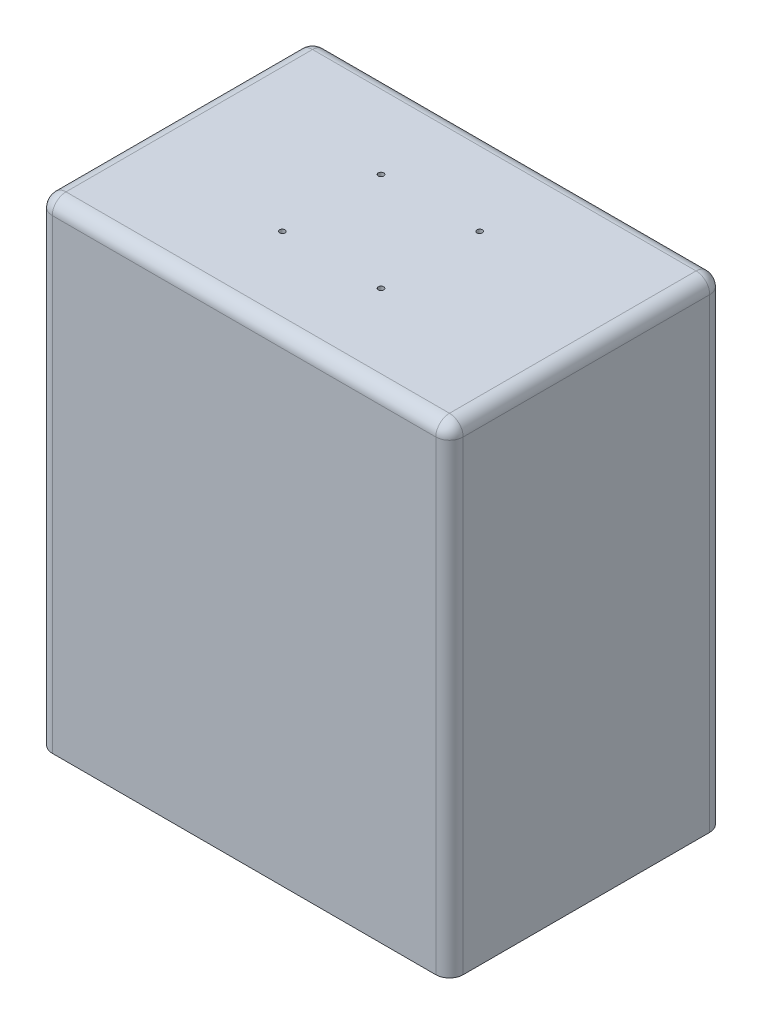
ISO-10303-21;
HEADER;
FILE_DESCRIPTION(('STEP AP214'),'2;1');
FILE_NAME('part.step','',(''),(''),'','','');
FILE_SCHEMA(('AUTOMOTIVE_DESIGN { 1 0 10303 214 1 1 1 1 }'));
ENDSEC;
DATA;
#1=APPLICATION_CONTEXT('core data for automotive mechanical design processes');
#2=APPLICATION_PROTOCOL_DEFINITION('international standard','automotive_design',2000,#1);
#3=PRODUCT_CONTEXT('',#1,'mechanical');
#4=PRODUCT('Part','Part','',(#3));
#5=PRODUCT_RELATED_PRODUCT_CATEGORY('part','',(#4));
#6=PRODUCT_DEFINITION_FORMATION('','',#4);
#7=PRODUCT_DEFINITION_CONTEXT('part definition',#1,'design');
#8=PRODUCT_DEFINITION('design','',#6,#7);
#9=PRODUCT_DEFINITION_SHAPE('','',#8);
#10=(LENGTH_UNIT() NAMED_UNIT(*) SI_UNIT(.MILLI.,.METRE.));
#11=(NAMED_UNIT(*) PLANE_ANGLE_UNIT() SI_UNIT($,.RADIAN.));
#12=(NAMED_UNIT(*) SI_UNIT($,.STERADIAN.) SOLID_ANGLE_UNIT());
#13=UNCERTAINTY_MEASURE_WITH_UNIT(LENGTH_MEASURE(1.E-05),#10,'distance_accuracy_value','');
#14=(GEOMETRIC_REPRESENTATION_CONTEXT(3) GLOBAL_UNCERTAINTY_ASSIGNED_CONTEXT((#13)) GLOBAL_UNIT_ASSIGNED_CONTEXT((#10,
#11,#12)) REPRESENTATION_CONTEXT('',''));
#15=CARTESIAN_POINT('',(0.,0.,0.));
#16=DIRECTION('',(0.,0.,1.));
#17=DIRECTION('',(1.,0.,0.));
#18=AXIS2_PLACEMENT_3D('',#15,#16,#17);
#19=CARTESIAN_POINT('',(-150.,350.,-100.));
#20=DIRECTION('',(1.,0.,0.));
#21=DIRECTION('',(0.,0.,-1.));
#22=AXIS2_PLACEMENT_3D('',#19,#20,#21);
#23=PLANE('',#22);
#24=DIRECTION('',(0.,0.,1.));
#25=VECTOR('',#24,1.);
#26=CARTESIAN_POINT('',(-150.,0.,-100.));
#27=LINE('',#26,#25);
#28=CARTESIAN_POINT('',(-150.,0.,-90.));
#29=VERTEX_POINT('',#28);
#30=CARTESIAN_POINT('',(-150.,0.,90.));
#31=VERTEX_POINT('',#30);
#32=EDGE_CURVE('E167',#29,#31,#27,.T.);
#33=ORIENTED_EDGE('',*,*,#32,.T.);
#34=DIRECTION('',(0.,-1.,0.));
#35=VECTOR('',#34,1.);
#36=CARTESIAN_POINT('',(-150.,350.,90.));
#37=LINE('',#36,#35);
#38=CARTESIAN_POINT('',(-150.,340.,90.));
#39=VERTEX_POINT('',#38);
#40=EDGE_CURVE('E272',#31,#39,#37,.F.);
#41=ORIENTED_EDGE('',*,*,#40,.T.);
#42=DIRECTION('',(0.,0.,1.));
#43=VECTOR('',#42,1.);
#44=CARTESIAN_POINT('',(-150.,340.,-100.));
#45=LINE('',#44,#43);
#46=CARTESIAN_POINT('',(-150.,340.,-90.));
#47=VERTEX_POINT('',#46);
#48=EDGE_CURVE('E266',#39,#47,#45,.F.);
#49=ORIENTED_EDGE('',*,*,#48,.T.);
#50=DIRECTION('',(0.,-1.,0.));
#51=VECTOR('',#50,1.);
#52=CARTESIAN_POINT('',(-150.,350.,-90.));
#53=LINE('',#52,#51);
#54=EDGE_CURVE('E269',#47,#29,#53,.T.);
#55=ORIENTED_EDGE('',*,*,#54,.T.);
#56=EDGE_LOOP('',(#33,#41,#49,#55));
#57=FACE_BOUND('',#56,.T.);
#58=ADVANCED_FACE('F39',(#57),#23,.F.);
#59=CARTESIAN_POINT('',(-150.,350.,100.));
#60=DIRECTION('',(0.,0.,-1.));
#61=DIRECTION('',(-1.,0.,0.));
#62=AXIS2_PLACEMENT_3D('',#59,#60,#61);
#63=PLANE('',#62);
#64=DIRECTION('',(1.,0.,0.));
#65=VECTOR('',#64,1.);
#66=CARTESIAN_POINT('',(-150.,340.,100.));
#67=LINE('',#66,#65);
#68=CARTESIAN_POINT('',(140.,340.,100.));
#69=VERTEX_POINT('',#68);
#70=CARTESIAN_POINT('',(-140.,340.,100.));
#71=VERTEX_POINT('',#70);
#72=EDGE_CURVE('E247',#69,#71,#67,.F.);
#73=ORIENTED_EDGE('',*,*,#72,.T.);
#74=DIRECTION('',(0.,-1.,0.));
#75=VECTOR('',#74,1.);
#76=CARTESIAN_POINT('',(-140.,350.,100.));
#77=LINE('',#76,#75);
#78=CARTESIAN_POINT('',(-140.,0.,100.));
#79=VERTEX_POINT('',#78);
#80=EDGE_CURVE('E251',#71,#79,#77,.T.);
#81=ORIENTED_EDGE('',*,*,#80,.T.);
#82=DIRECTION('',(1.,0.,0.));
#83=VECTOR('',#82,1.);
#84=CARTESIAN_POINT('',(-150.,0.,100.));
#85=LINE('',#84,#83);
#86=CARTESIAN_POINT('',(140.,0.,100.));
#87=VERTEX_POINT('',#86);
#88=EDGE_CURVE('E173',#79,#87,#85,.T.);
#89=ORIENTED_EDGE('',*,*,#88,.T.);
#90=DIRECTION('',(0.,-1.,0.));
#91=VECTOR('',#90,1.);
#92=CARTESIAN_POINT('',(140.,350.,100.));
#93=LINE('',#92,#91);
#94=EDGE_CURVE('E244',#87,#69,#93,.F.);
#95=ORIENTED_EDGE('',*,*,#94,.T.);
#96=EDGE_LOOP('',(#73,#81,#89,#95));
#97=FACE_BOUND('',#96,.T.);
#98=ADVANCED_FACE('F378',(#97),#63,.F.);
#99=CARTESIAN_POINT('',(150.,350.,-100.));
#100=DIRECTION('',(-1.,0.,0.));
#101=DIRECTION('',(0.,0.,1.));
#102=AXIS2_PLACEMENT_3D('',#99,#100,#101);
#103=PLANE('',#102);
#104=DIRECTION('',(0.,0.,-1.));
#105=VECTOR('',#104,1.);
#106=CARTESIAN_POINT('',(150.,340.,100.));
#107=LINE('',#106,#105);
#108=CARTESIAN_POINT('',(150.,340.,-90.));
#109=VERTEX_POINT('',#108);
#110=CARTESIAN_POINT('',(150.,340.,90.));
#111=VERTEX_POINT('',#110);
#112=EDGE_CURVE('E275',#109,#111,#107,.F.);
#113=ORIENTED_EDGE('',*,*,#112,.T.);
#114=DIRECTION('',(0.,-1.,0.));
#115=VECTOR('',#114,1.);
#116=CARTESIAN_POINT('',(150.,350.,90.));
#117=LINE('',#116,#115);
#118=CARTESIAN_POINT('',(150.,0.,89.9999999999999));
#119=VERTEX_POINT('',#118);
#120=EDGE_CURVE('E281',#111,#119,#117,.T.);
#121=ORIENTED_EDGE('',*,*,#120,.T.);
#122=DIRECTION('',(0.,0.,-1.));
#123=VECTOR('',#122,1.);
#124=CARTESIAN_POINT('',(150.,0.,-100.));
#125=LINE('',#124,#123);
#126=CARTESIAN_POINT('',(150.,0.,-90.));
#127=VERTEX_POINT('',#126);
#128=EDGE_CURVE('E206',#119,#127,#125,.T.);
#129=ORIENTED_EDGE('',*,*,#128,.T.);
#130=DIRECTION('',(0.,-1.,0.));
#131=VECTOR('',#130,1.);
#132=CARTESIAN_POINT('',(150.,350.,-90.));
#133=LINE('',#132,#131);
#134=EDGE_CURVE('E278',#127,#109,#133,.F.);
#135=ORIENTED_EDGE('',*,*,#134,.T.);
#136=EDGE_LOOP('',(#113,#121,#129,#135));
#137=FACE_BOUND('',#136,.T.);
#138=ADVANCED_FACE('F384',(#137),#103,.F.);
#139=CARTESIAN_POINT('',(-150.,350.,-100.));
#140=DIRECTION('',(0.,0.,1.));
#141=DIRECTION('',(1.,0.,0.));
#142=AXIS2_PLACEMENT_3D('',#139,#140,#141);
#143=PLANE('',#142);
#144=DIRECTION('',(-1.,0.,0.));
#145=VECTOR('',#144,1.);
#146=CARTESIAN_POINT('',(-150.,0.,-100.));
#147=LINE('',#146,#145);
#148=CARTESIAN_POINT('',(140.,0.,-100.));
#149=VERTEX_POINT('',#148);
#150=CARTESIAN_POINT('',(-140.,0.,-100.));
#151=VERTEX_POINT('',#150);
#152=EDGE_CURVE('E210',#149,#151,#147,.T.);
#153=ORIENTED_EDGE('',*,*,#152,.T.);
#154=DIRECTION('',(0.,-1.,0.));
#155=VECTOR('',#154,1.);
#156=CARTESIAN_POINT('',(-140.,350.,-100.));
#157=LINE('',#156,#155);
#158=CARTESIAN_POINT('',(-140.,340.,-100.));
#159=VERTEX_POINT('',#158);
#160=EDGE_CURVE('E11',#151,#159,#157,.F.);
#161=ORIENTED_EDGE('',*,*,#160,.T.);
#162=DIRECTION('',(-1.,0.,0.));
#163=VECTOR('',#162,1.);
#164=CARTESIAN_POINT('',(150.,340.,-100.));
#165=LINE('',#164,#163);
#166=CARTESIAN_POINT('',(140.,340.,-100.));
#167=VERTEX_POINT('',#166);
#168=EDGE_CURVE('E56',#159,#167,#165,.F.);
#169=ORIENTED_EDGE('',*,*,#168,.T.);
#170=DIRECTION('',(0.,-1.,0.));
#171=VECTOR('',#170,1.);
#172=CARTESIAN_POINT('',(140.,350.,-100.));
#173=LINE('',#172,#171);
#174=EDGE_CURVE('E49',#167,#149,#173,.T.);
#175=ORIENTED_EDGE('',*,*,#174,.T.);
#176=EDGE_LOOP('',(#153,#161,#169,#175));
#177=FACE_BOUND('',#176,.T.);
#178=ADVANCED_FACE('F353',(#177),#143,.F.);
#179=CARTESIAN_POINT('',(-150.,350.,100.));
#180=DIRECTION('',(0.,1.,0.));
#181=DIRECTION('',(0.,0.,1.));
#182=AXIS2_PLACEMENT_3D('',#179,#180,#181);
#183=PLANE('',#182);
#184=DIRECTION('',(0.,0.,1.));
#185=VECTOR('',#184,1.);
#186=CARTESIAN_POINT('',(-140.,350.,100.));
#187=LINE('',#186,#185);
#188=CARTESIAN_POINT('',(-140.,350.,-90.));
#189=VERTEX_POINT('',#188);
#190=CARTESIAN_POINT('',(-140.,350.,90.));
#191=VERTEX_POINT('',#190);
#192=EDGE_CURVE('E237',#189,#191,#187,.T.);
#193=ORIENTED_EDGE('',*,*,#192,.T.);
#194=DIRECTION('',(1.,0.,0.));
#195=VECTOR('',#194,1.);
#196=CARTESIAN_POINT('',(150.,350.,90.));
#197=LINE('',#196,#195);
#198=CARTESIAN_POINT('',(140.,350.,90.));
#199=VERTEX_POINT('',#198);
#200=EDGE_CURVE('E240',#191,#199,#197,.T.);
#201=ORIENTED_EDGE('',*,*,#200,.T.);
#202=DIRECTION('',(0.,0.,-1.));
#203=VECTOR('',#202,1.);
#204=CARTESIAN_POINT('',(140.,350.,-100.));
#205=LINE('',#204,#203);
#206=CARTESIAN_POINT('',(140.,350.,-90.));
#207=VERTEX_POINT('',#206);
#208=EDGE_CURVE('E213',#199,#207,#205,.T.);
#209=ORIENTED_EDGE('',*,*,#208,.T.);
#210=DIRECTION('',(-1.,0.,0.));
#211=VECTOR('',#210,1.);
#212=CARTESIAN_POINT('',(-150.,350.,-90.));
#213=LINE('',#212,#211);
#214=EDGE_CURVE('E234',#207,#189,#213,.T.);
#215=ORIENTED_EDGE('',*,*,#214,.T.);
#216=EDGE_LOOP('',(#193,#201,#209,#215));
#217=FACE_BOUND('',#216,.T.);
#218=CARTESIAN_POINT('',(36.,350.,36.));
#219=DIRECTION('',(0.,1.,0.));
#220=DIRECTION('',(0.,0.,1.));
#221=AXIS2_PLACEMENT_3D('',#218,#219,#220);
#222=CIRCLE('',#221,2.);
#223=CARTESIAN_POINT('',(36.,350.,38.));
#224=VERTEX_POINT('',#223);
#225=EDGE_CURVE('E231',#224,#224,#222,.T.);
#226=ORIENTED_EDGE('',*,*,#225,.F.);
#227=EDGE_LOOP('',(#226));
#228=FACE_BOUND('',#227,.T.);
#229=CARTESIAN_POINT('',(-36.,350.,36.));
#230=DIRECTION('',(0.,1.,0.));
#231=DIRECTION('',(0.,0.,-1.));
#232=AXIS2_PLACEMENT_3D('',#229,#230,#231);
#233=CIRCLE('',#232,2.);
#234=CARTESIAN_POINT('',(-36.,350.,34.));
#235=VERTEX_POINT('',#234);
#236=EDGE_CURVE('E226',#235,#235,#233,.T.);
#237=ORIENTED_EDGE('',*,*,#236,.F.);
#238=EDGE_LOOP('',(#237));
#239=FACE_BOUND('',#238,.T.);
#240=CARTESIAN_POINT('',(36.,350.,-36.));
#241=DIRECTION('',(0.,1.,0.));
#242=DIRECTION('',(0.,0.,-1.));
#243=AXIS2_PLACEMENT_3D('',#240,#241,#242);
#244=CIRCLE('',#243,2.);
#245=CARTESIAN_POINT('',(36.,350.,-38.));
#246=VERTEX_POINT('',#245);
#247=EDGE_CURVE('E221',#246,#246,#244,.T.);
#248=ORIENTED_EDGE('',*,*,#247,.F.);
#249=EDGE_LOOP('',(#248));
#250=FACE_BOUND('',#249,.T.);
#251=CARTESIAN_POINT('',(-36.,350.,-36.));
#252=DIRECTION('',(0.,1.,0.));
#253=DIRECTION('',(0.,0.,1.));
#254=AXIS2_PLACEMENT_3D('',#251,#252,#253);
#255=CIRCLE('',#254,2.);
#256=CARTESIAN_POINT('',(-36.,350.,-34.));
#257=VERTEX_POINT('',#256);
#258=EDGE_CURVE('E178',#257,#257,#255,.T.);
#259=ORIENTED_EDGE('',*,*,#258,.F.);
#260=EDGE_LOOP('',(#259));
#261=FACE_BOUND('',#260,.T.);
#262=ADVANCED_FACE('F349',(#217,#228,#239,#250,#261),#183,.T.);
#263=CARTESIAN_POINT('',(-150.,0.,100.));
#264=DIRECTION('',(0.,1.,0.));
#265=DIRECTION('',(0.,0.,1.));
#266=AXIS2_PLACEMENT_3D('',#263,#264,#265);
#267=PLANE('',#266);
#268=DIRECTION('',(-1.,0.,0.));
#269=VECTOR('',#268,1.);
#270=CARTESIAN_POINT('',(-150.,0.,-95.));
#271=LINE('',#270,#269);
#272=CARTESIAN_POINT('',(145.,0.,-95.));
#273=VERTEX_POINT('',#272);
#274=CARTESIAN_POINT('',(-145.,0.,-95.));
#275=VERTEX_POINT('',#274);
#276=EDGE_CURVE('E161',#273,#275,#271,.T.);
#277=ORIENTED_EDGE('',*,*,#276,.T.);
#278=DIRECTION('',(0.,0.,1.));
#279=VECTOR('',#278,1.);
#280=CARTESIAN_POINT('',(-145.,0.,-100.));
#281=LINE('',#280,#279);
#282=CARTESIAN_POINT('',(-145.,0.,95.));
#283=VERTEX_POINT('',#282);
#284=EDGE_CURVE('E190',#275,#283,#281,.T.);
#285=ORIENTED_EDGE('',*,*,#284,.T.);
#286=DIRECTION('',(1.,0.,0.));
#287=VECTOR('',#286,1.);
#288=CARTESIAN_POINT('',(-150.,0.,95.));
#289=LINE('',#288,#287);
#290=CARTESIAN_POINT('',(145.,0.,95.));
#291=VERTEX_POINT('',#290);
#292=EDGE_CURVE('E165',#283,#291,#289,.T.);
#293=ORIENTED_EDGE('',*,*,#292,.T.);
#294=DIRECTION('',(0.,0.,-1.));
#295=VECTOR('',#294,1.);
#296=CARTESIAN_POINT('',(145.,0.,-100.));
#297=LINE('',#296,#295);
#298=EDGE_CURVE('E197',#291,#273,#297,.T.);
#299=ORIENTED_EDGE('',*,*,#298,.T.);
#300=EDGE_LOOP('',(#277,#285,#293,#299));
#301=FACE_BOUND('',#300,.T.);
#302=ORIENTED_EDGE('',*,*,#88,.F.);
#303=CARTESIAN_POINT('',(-140.,0.,90.));
#304=DIRECTION('',(0.,1.,0.));
#305=DIRECTION('',(0.,0.,1.));
#306=AXIS2_PLACEMENT_3D('',#303,#304,#305);
#307=CIRCLE('',#306,10.);
#308=EDGE_CURVE('E263',#79,#31,#307,.F.);
#309=ORIENTED_EDGE('',*,*,#308,.T.);
#310=ORIENTED_EDGE('',*,*,#32,.F.);
#311=CARTESIAN_POINT('',(-140.,0.,-90.));
#312=DIRECTION('',(0.,1.,0.));
#313=DIRECTION('',(0.,0.,1.));
#314=AXIS2_PLACEMENT_3D('',#311,#312,#313);
#315=CIRCLE('',#314,10.);
#316=EDGE_CURVE('E257',#29,#151,#315,.F.);
#317=ORIENTED_EDGE('',*,*,#316,.T.);
#318=ORIENTED_EDGE('',*,*,#152,.F.);
#319=CARTESIAN_POINT('',(140.,0.,-90.));
#320=DIRECTION('',(0.,1.,0.));
#321=DIRECTION('',(0.,0.,1.));
#322=AXIS2_PLACEMENT_3D('',#319,#320,#321);
#323=CIRCLE('',#322,10.);
#324=EDGE_CURVE('E254',#149,#127,#323,.F.);
#325=ORIENTED_EDGE('',*,*,#324,.T.);
#326=ORIENTED_EDGE('',*,*,#128,.F.);
#327=CARTESIAN_POINT('',(140.,0.,90.));
#328=DIRECTION('',(0.,1.,0.));
#329=DIRECTION('',(0.,0.,1.));
#330=AXIS2_PLACEMENT_3D('',#327,#328,#329);
#331=CIRCLE('',#330,10.);
#332=EDGE_CURVE('E260',#119,#87,#331,.F.);
#333=ORIENTED_EDGE('',*,*,#332,.T.);
#334=EDGE_LOOP('',(#302,#309,#310,#317,#318,#325,#326,#333));
#335=FACE_BOUND('',#334,.T.);
#336=ADVANCED_FACE('F352',(#301,#335),#267,.F.);
#337=CARTESIAN_POINT('',(-145.,350.,-100.));
#338=DIRECTION('',(1.,0.,0.));
#339=DIRECTION('',(0.,0.,-1.));
#340=AXIS2_PLACEMENT_3D('',#337,#338,#339);
#341=PLANE('',#340);
#342=ORIENTED_EDGE('',*,*,#284,.F.);
#343=DIRECTION('',(0.,-1.,0.));
#344=VECTOR('',#343,1.);
#345=CARTESIAN_POINT('',(-145.,350.,-95.));
#346=LINE('',#345,#344);
#347=CARTESIAN_POINT('',(-145.,345.,-95.));
#348=VERTEX_POINT('',#347);
#349=EDGE_CURVE('E159',#348,#275,#346,.T.);
#350=ORIENTED_EDGE('',*,*,#349,.F.);
#351=DIRECTION('',(0.,0.,1.));
#352=VECTOR('',#351,1.);
#353=CARTESIAN_POINT('',(-145.,345.,-100.));
#354=LINE('',#353,#352);
#355=CARTESIAN_POINT('',(-145.,345.,95.));
#356=VERTEX_POINT('',#355);
#357=EDGE_CURVE('E144',#348,#356,#354,.T.);
#358=ORIENTED_EDGE('',*,*,#357,.T.);
#359=DIRECTION('',(0.,-1.,0.));
#360=VECTOR('',#359,1.);
#361=CARTESIAN_POINT('',(-145.,350.,95.));
#362=LINE('',#361,#360);
#363=EDGE_CURVE('E157',#356,#283,#362,.T.);
#364=ORIENTED_EDGE('',*,*,#363,.T.);
#365=EDGE_LOOP('',(#342,#350,#358,#364));
#366=FACE_BOUND('',#365,.T.);
#367=ADVANCED_FACE('F156',(#366),#341,.T.);
#368=CARTESIAN_POINT('',(-150.,350.,95.));
#369=DIRECTION('',(0.,0.,-1.));
#370=DIRECTION('',(-1.,0.,0.));
#371=AXIS2_PLACEMENT_3D('',#368,#369,#370);
#372=PLANE('',#371);
#373=ORIENTED_EDGE('',*,*,#292,.F.);
#374=ORIENTED_EDGE('',*,*,#363,.F.);
#375=DIRECTION('',(1.,0.,0.));
#376=VECTOR('',#375,1.);
#377=CARTESIAN_POINT('',(-150.,345.,95.));
#378=LINE('',#377,#376);
#379=CARTESIAN_POINT('',(145.,345.,95.));
#380=VERTEX_POINT('',#379);
#381=EDGE_CURVE('E140',#356,#380,#378,.T.);
#382=ORIENTED_EDGE('',*,*,#381,.T.);
#383=DIRECTION('',(0.,-1.,0.));
#384=VECTOR('',#383,1.);
#385=CARTESIAN_POINT('',(145.,350.,95.));
#386=LINE('',#385,#384);
#387=EDGE_CURVE('E168',#380,#291,#386,.T.);
#388=ORIENTED_EDGE('',*,*,#387,.T.);
#389=EDGE_LOOP('',(#373,#374,#382,#388));
#390=FACE_BOUND('',#389,.T.);
#391=ADVANCED_FACE('F163',(#390),#372,.T.);
#392=CARTESIAN_POINT('',(145.,350.,-100.));
#393=DIRECTION('',(-1.,0.,0.));
#394=DIRECTION('',(0.,0.,1.));
#395=AXIS2_PLACEMENT_3D('',#392,#393,#394);
#396=PLANE('',#395);
#397=ORIENTED_EDGE('',*,*,#298,.F.);
#398=ORIENTED_EDGE('',*,*,#387,.F.);
#399=DIRECTION('',(0.,0.,-1.));
#400=VECTOR('',#399,1.);
#401=CARTESIAN_POINT('',(145.,345.,-100.));
#402=LINE('',#401,#400);
#403=CARTESIAN_POINT('',(145.,345.,-95.));
#404=VERTEX_POINT('',#403);
#405=EDGE_CURVE('E145',#380,#404,#402,.T.);
#406=ORIENTED_EDGE('',*,*,#405,.T.);
#407=DIRECTION('',(0.,-1.,0.));
#408=VECTOR('',#407,1.);
#409=CARTESIAN_POINT('',(145.,350.,-95.));
#410=LINE('',#409,#408);
#411=EDGE_CURVE('E175',#404,#273,#410,.T.);
#412=ORIENTED_EDGE('',*,*,#411,.T.);
#413=EDGE_LOOP('',(#397,#398,#406,#412));
#414=FACE_BOUND('',#413,.T.);
#415=ADVANCED_FACE('F373',(#414),#396,.T.);
#416=CARTESIAN_POINT('',(-150.,350.,-95.));
#417=DIRECTION('',(0.,0.,1.));
#418=DIRECTION('',(1.,0.,0.));
#419=AXIS2_PLACEMENT_3D('',#416,#417,#418);
#420=PLANE('',#419);
#421=ORIENTED_EDGE('',*,*,#276,.F.);
#422=ORIENTED_EDGE('',*,*,#411,.F.);
#423=DIRECTION('',(-1.,0.,0.));
#424=VECTOR('',#423,1.);
#425=CARTESIAN_POINT('',(-150.,345.,-95.));
#426=LINE('',#425,#424);
#427=EDGE_CURVE('E182',#404,#348,#426,.T.);
#428=ORIENTED_EDGE('',*,*,#427,.T.);
#429=ORIENTED_EDGE('',*,*,#349,.T.);
#430=EDGE_LOOP('',(#421,#422,#428,#429));
#431=FACE_BOUND('',#430,.T.);
#432=ADVANCED_FACE('F367',(#431),#420,.T.);
#433=CARTESIAN_POINT('',(-150.,345.,100.));
#434=DIRECTION('',(0.,1.,0.));
#435=DIRECTION('',(0.,0.,1.));
#436=AXIS2_PLACEMENT_3D('',#433,#434,#435);
#437=PLANE('',#436);
#438=CARTESIAN_POINT('',(36.,345.,36.));
#439=DIRECTION('',(0.,1.,0.));
#440=DIRECTION('',(0.,0.,1.));
#441=AXIS2_PLACEMENT_3D('',#438,#439,#440);
#442=CIRCLE('',#441,2.);
#443=CARTESIAN_POINT('',(36.,345.,38.));
#444=VERTEX_POINT('',#443);
#445=EDGE_CURVE('E227',#444,#444,#442,.T.);
#446=ORIENTED_EDGE('',*,*,#445,.T.);
#447=EDGE_LOOP('',(#446));
#448=FACE_BOUND('',#447,.T.);
#449=CARTESIAN_POINT('',(-36.,345.,36.));
#450=DIRECTION('',(0.,1.,0.));
#451=DIRECTION('',(0.,0.,1.));
#452=AXIS2_PLACEMENT_3D('',#449,#450,#451);
#453=CIRCLE('',#452,2.);
#454=CARTESIAN_POINT('',(-36.,345.,38.));
#455=VERTEX_POINT('',#454);
#456=EDGE_CURVE('E222',#455,#455,#453,.T.);
#457=ORIENTED_EDGE('',*,*,#456,.T.);
#458=EDGE_LOOP('',(#457));
#459=FACE_BOUND('',#458,.T.);
#460=CARTESIAN_POINT('',(36.,345.,-36.));
#461=DIRECTION('',(0.,1.,0.));
#462=DIRECTION('',(0.,0.,1.));
#463=AXIS2_PLACEMENT_3D('',#460,#461,#462);
#464=CIRCLE('',#463,2.);
#465=CARTESIAN_POINT('',(36.,345.,-34.));
#466=VERTEX_POINT('',#465);
#467=EDGE_CURVE('E217',#466,#466,#464,.T.);
#468=ORIENTED_EDGE('',*,*,#467,.T.);
#469=EDGE_LOOP('',(#468));
#470=FACE_BOUND('',#469,.T.);
#471=CARTESIAN_POINT('',(-36.,345.,-36.));
#472=DIRECTION('',(0.,1.,0.));
#473=DIRECTION('',(0.,0.,1.));
#474=AXIS2_PLACEMENT_3D('',#471,#472,#473);
#475=CIRCLE('',#474,2.);
#476=CARTESIAN_POINT('',(-36.,345.,-34.));
#477=VERTEX_POINT('',#476);
#478=EDGE_CURVE('E193',#477,#477,#475,.T.);
#479=ORIENTED_EDGE('',*,*,#478,.T.);
#480=EDGE_LOOP('',(#479));
#481=FACE_BOUND('',#480,.T.);
#482=ORIENTED_EDGE('',*,*,#357,.F.);
#483=ORIENTED_EDGE('',*,*,#427,.F.);
#484=ORIENTED_EDGE('',*,*,#405,.F.);
#485=ORIENTED_EDGE('',*,*,#381,.F.);
#486=EDGE_LOOP('',(#482,#483,#484,#485));
#487=FACE_BOUND('',#486,.T.);
#488=ADVANCED_FACE('F142',(#448,#459,#470,#481,#487),#437,.F.);
#489=CARTESIAN_POINT('',(-36.,0.,-36.));
#490=DIRECTION('',(0.,1.,0.));
#491=DIRECTION('',(0.,0.,1.));
#492=AXIS2_PLACEMENT_3D('',#489,#490,#491);
#493=CYLINDRICAL_SURFACE('',#492,2.);
#494=ORIENTED_EDGE('',*,*,#258,.T.);
#495=EDGE_LOOP('',(#494));
#496=FACE_BOUND('',#495,.T.);
#497=ORIENTED_EDGE('',*,*,#478,.F.);
#498=EDGE_LOOP('',(#497));
#499=FACE_BOUND('',#498,.T.);
#500=ADVANCED_FACE('F360',(#496,#499),#493,.F.);
#501=CARTESIAN_POINT('',(36.,0.,-36.));
#502=DIRECTION('',(0.,1.,0.));
#503=DIRECTION('',(0.,0.,1.));
#504=AXIS2_PLACEMENT_3D('',#501,#502,#503);
#505=CYLINDRICAL_SURFACE('',#504,2.);
#506=ORIENTED_EDGE('',*,*,#247,.T.);
#507=EDGE_LOOP('',(#506));
#508=FACE_BOUND('',#507,.T.);
#509=ORIENTED_EDGE('',*,*,#467,.F.);
#510=EDGE_LOOP('',(#509));
#511=FACE_BOUND('',#510,.T.);
#512=ADVANCED_FACE('F346',(#508,#511),#505,.F.);
#513=CARTESIAN_POINT('',(-36.,0.,36.));
#514=DIRECTION('',(0.,1.,0.));
#515=DIRECTION('',(0.,0.,1.));
#516=AXIS2_PLACEMENT_3D('',#513,#514,#515);
#517=CYLINDRICAL_SURFACE('',#516,2.);
#518=ORIENTED_EDGE('',*,*,#236,.T.);
#519=EDGE_LOOP('',(#518));
#520=FACE_BOUND('',#519,.T.);
#521=ORIENTED_EDGE('',*,*,#456,.F.);
#522=EDGE_LOOP('',(#521));
#523=FACE_BOUND('',#522,.T.);
#524=ADVANCED_FACE('F492',(#520,#523),#517,.F.);
#525=CARTESIAN_POINT('',(36.,0.,36.));
#526=DIRECTION('',(0.,1.,0.));
#527=DIRECTION('',(0.,0.,1.));
#528=AXIS2_PLACEMENT_3D('',#525,#526,#527);
#529=CYLINDRICAL_SURFACE('',#528,2.);
#530=ORIENTED_EDGE('',*,*,#225,.T.);
#531=EDGE_LOOP('',(#530));
#532=FACE_BOUND('',#531,.T.);
#533=ORIENTED_EDGE('',*,*,#445,.F.);
#534=EDGE_LOOP('',(#533));
#535=FACE_BOUND('',#534,.T.);
#536=ADVANCED_FACE('F433',(#532,#535),#529,.F.);
#537=CARTESIAN_POINT('',(-140.,350.,-90.));
#538=DIRECTION('',(0.,-1.,0.));
#539=DIRECTION('',(0.,0.,-1.));
#540=AXIS2_PLACEMENT_3D('',#537,#538,#539);
#541=CYLINDRICAL_SURFACE('',#540,10.);
#542=ORIENTED_EDGE('',*,*,#316,.F.);
#543=ORIENTED_EDGE('',*,*,#54,.F.);
#544=CARTESIAN_POINT('',(-140.,340.,-90.));
#545=DIRECTION('',(0.,1.,0.));
#546=DIRECTION('',(0.,0.,1.));
#547=AXIS2_PLACEMENT_3D('',#544,#545,#546);
#548=CIRCLE('',#547,10.);
#549=EDGE_CURVE('E43',#159,#47,#548,.T.);
#550=ORIENTED_EDGE('',*,*,#549,.F.);
#551=ORIENTED_EDGE('',*,*,#160,.F.);
#552=EDGE_LOOP('',(#542,#543,#550,#551));
#553=FACE_BOUND('',#552,.T.);
#554=ADVANCED_FACE('F41',(#553),#541,.T.);
#555=CARTESIAN_POINT('',(-150.,340.,-90.));
#556=DIRECTION('',(1.,0.,0.));
#557=DIRECTION('',(0.,0.,-1.));
#558=AXIS2_PLACEMENT_3D('',#555,#556,#557);
#559=CYLINDRICAL_SURFACE('',#558,10.);
#560=CARTESIAN_POINT('',(140.,340.,-90.));
#561=DIRECTION('',(1.,0.,0.));
#562=DIRECTION('',(0.,0.,-1.));
#563=AXIS2_PLACEMENT_3D('',#560,#561,#562);
#564=CIRCLE('',#563,10.);
#565=EDGE_CURVE('E322',#167,#207,#564,.T.);
#566=ORIENTED_EDGE('',*,*,#565,.F.);
#567=ORIENTED_EDGE('',*,*,#168,.F.);
#568=CARTESIAN_POINT('',(-140.,340.,-90.));
#569=DIRECTION('',(-1.,0.,0.));
#570=DIRECTION('',(0.,0.,1.));
#571=AXIS2_PLACEMENT_3D('',#568,#569,#570);
#572=CIRCLE('',#571,10.);
#573=EDGE_CURVE('E325',#189,#159,#572,.T.);
#574=ORIENTED_EDGE('',*,*,#573,.F.);
#575=ORIENTED_EDGE('',*,*,#214,.F.);
#576=EDGE_LOOP('',(#566,#567,#574,#575));
#577=FACE_BOUND('',#576,.T.);
#578=ADVANCED_FACE('F426',(#577),#559,.T.);
#579=CARTESIAN_POINT('',(140.,350.,-90.));
#580=DIRECTION('',(0.,-1.,0.));
#581=DIRECTION('',(0.,0.,-1.));
#582=AXIS2_PLACEMENT_3D('',#579,#580,#581);
#583=CYLINDRICAL_SURFACE('',#582,10.);
#584=ORIENTED_EDGE('',*,*,#324,.F.);
#585=ORIENTED_EDGE('',*,*,#174,.F.);
#586=CARTESIAN_POINT('',(140.,340.,-90.));
#587=DIRECTION('',(0.,1.,0.));
#588=DIRECTION('',(0.,0.,1.));
#589=AXIS2_PLACEMENT_3D('',#586,#587,#588);
#590=CIRCLE('',#589,10.);
#591=EDGE_CURVE('E318',#109,#167,#590,.T.);
#592=ORIENTED_EDGE('',*,*,#591,.F.);
#593=ORIENTED_EDGE('',*,*,#134,.F.);
#594=EDGE_LOOP('',(#584,#585,#592,#593));
#595=FACE_BOUND('',#594,.T.);
#596=ADVANCED_FACE('F424',(#595),#583,.T.);
#597=CARTESIAN_POINT('',(-140.,340.,-90.));
#598=DIRECTION('',(0.,0.,1.));
#599=DIRECTION('',(1.,0.,0.));
#600=AXIS2_PLACEMENT_3D('',#597,#598,#599);
#601=SPHERICAL_SURFACE('',#600,10.);
#602=ORIENTED_EDGE('',*,*,#573,.T.);
#603=ORIENTED_EDGE('',*,*,#549,.T.);
#604=CARTESIAN_POINT('',(-140.,340.,-90.));
#605=DIRECTION('',(0.,0.,-1.));
#606=DIRECTION('',(0.,1.,0.));
#607=AXIS2_PLACEMENT_3D('',#604,#605,#606);
#608=CIRCLE('',#607,10.);
#609=EDGE_CURVE('E314',#189,#47,#608,.F.);
#610=ORIENTED_EDGE('',*,*,#609,.F.);
#611=EDGE_LOOP('',(#602,#603,#610));
#612=FACE_BOUND('',#611,.T.);
#613=ADVANCED_FACE('F420',(#612),#601,.T.);
#614=CARTESIAN_POINT('',(140.,340.,-90.));
#615=DIRECTION('',(0.,0.,1.));
#616=DIRECTION('',(1.,0.,0.));
#617=AXIS2_PLACEMENT_3D('',#614,#615,#616);
#618=SPHERICAL_SURFACE('',#617,10.);
#619=ORIENTED_EDGE('',*,*,#591,.T.);
#620=ORIENTED_EDGE('',*,*,#565,.T.);
#621=CARTESIAN_POINT('',(140.,340.,-90.));
#622=DIRECTION('',(0.,0.,-1.));
#623=DIRECTION('',(-1.,0.,0.));
#624=AXIS2_PLACEMENT_3D('',#621,#622,#623);
#625=CIRCLE('',#624,10.);
#626=EDGE_CURVE('E310',#109,#207,#625,.F.);
#627=ORIENTED_EDGE('',*,*,#626,.F.);
#628=EDGE_LOOP('',(#619,#620,#627));
#629=FACE_BOUND('',#628,.T.);
#630=ADVANCED_FACE('F416',(#629),#618,.T.);
#631=CARTESIAN_POINT('',(-140.,350.,90.));
#632=DIRECTION('',(0.,-1.,0.));
#633=DIRECTION('',(0.,0.,-1.));
#634=AXIS2_PLACEMENT_3D('',#631,#632,#633);
#635=CYLINDRICAL_SURFACE('',#634,10.);
#636=ORIENTED_EDGE('',*,*,#308,.F.);
#637=ORIENTED_EDGE('',*,*,#80,.F.);
#638=CARTESIAN_POINT('',(-140.,340.,90.));
#639=DIRECTION('',(0.,1.,0.));
#640=DIRECTION('',(0.,0.,1.));
#641=AXIS2_PLACEMENT_3D('',#638,#639,#640);
#642=CIRCLE('',#641,10.);
#643=EDGE_CURVE('E306',#39,#71,#642,.T.);
#644=ORIENTED_EDGE('',*,*,#643,.F.);
#645=ORIENTED_EDGE('',*,*,#40,.F.);
#646=EDGE_LOOP('',(#636,#637,#644,#645));
#647=FACE_BOUND('',#646,.T.);
#648=ADVANCED_FACE('F412',(#647),#635,.T.);
#649=CARTESIAN_POINT('',(-140.,340.,100.));
#650=DIRECTION('',(0.,0.,-1.));
#651=DIRECTION('',(-1.,0.,0.));
#652=AXIS2_PLACEMENT_3D('',#649,#650,#651);
#653=CYLINDRICAL_SURFACE('',#652,10.);
#654=ORIENTED_EDGE('',*,*,#609,.T.);
#655=ORIENTED_EDGE('',*,*,#48,.F.);
#656=CARTESIAN_POINT('',(-140.,340.,90.));
#657=DIRECTION('',(0.,0.,1.));
#658=DIRECTION('',(1.,0.,0.));
#659=AXIS2_PLACEMENT_3D('',#656,#657,#658);
#660=CIRCLE('',#659,10.);
#661=EDGE_CURVE('E302',#191,#39,#660,.T.);
#662=ORIENTED_EDGE('',*,*,#661,.F.);
#663=ORIENTED_EDGE('',*,*,#192,.F.);
#664=EDGE_LOOP('',(#654,#655,#662,#663));
#665=FACE_BOUND('',#664,.T.);
#666=ADVANCED_FACE('F408',(#665),#653,.T.);
#667=CARTESIAN_POINT('',(140.,340.,100.));
#668=DIRECTION('',(0.,0.,1.));
#669=DIRECTION('',(1.,0.,0.));
#670=AXIS2_PLACEMENT_3D('',#667,#668,#669);
#671=CYLINDRICAL_SURFACE('',#670,10.);
#672=ORIENTED_EDGE('',*,*,#626,.T.);
#673=ORIENTED_EDGE('',*,*,#208,.F.);
#674=CARTESIAN_POINT('',(140.,340.,90.));
#675=DIRECTION('',(0.,0.,1.));
#676=DIRECTION('',(0.,-1.,0.));
#677=AXIS2_PLACEMENT_3D('',#674,#675,#676);
#678=CIRCLE('',#677,10.);
#679=EDGE_CURVE('E298',#111,#199,#678,.T.);
#680=ORIENTED_EDGE('',*,*,#679,.F.);
#681=ORIENTED_EDGE('',*,*,#112,.F.);
#682=EDGE_LOOP('',(#672,#673,#680,#681));
#683=FACE_BOUND('',#682,.T.);
#684=ADVANCED_FACE('F404',(#683),#671,.T.);
#685=CARTESIAN_POINT('',(140.,350.,90.));
#686=DIRECTION('',(0.,-1.,0.));
#687=DIRECTION('',(0.,0.,-1.));
#688=AXIS2_PLACEMENT_3D('',#685,#686,#687);
#689=CYLINDRICAL_SURFACE('',#688,10.);
#690=ORIENTED_EDGE('',*,*,#332,.F.);
#691=ORIENTED_EDGE('',*,*,#120,.F.);
#692=CARTESIAN_POINT('',(140.,340.,90.));
#693=DIRECTION('',(0.,1.,0.));
#694=DIRECTION('',(0.,0.,1.));
#695=AXIS2_PLACEMENT_3D('',#692,#693,#694);
#696=CIRCLE('',#695,10.);
#697=EDGE_CURVE('E294',#69,#111,#696,.T.);
#698=ORIENTED_EDGE('',*,*,#697,.F.);
#699=ORIENTED_EDGE('',*,*,#94,.F.);
#700=EDGE_LOOP('',(#690,#691,#698,#699));
#701=FACE_BOUND('',#700,.T.);
#702=ADVANCED_FACE('F400',(#701),#689,.T.);
#703=CARTESIAN_POINT('',(-140.,340.,90.));
#704=DIRECTION('',(0.,0.,1.));
#705=DIRECTION('',(1.,0.,0.));
#706=AXIS2_PLACEMENT_3D('',#703,#704,#705);
#707=SPHERICAL_SURFACE('',#706,10.);
#708=ORIENTED_EDGE('',*,*,#661,.T.);
#709=ORIENTED_EDGE('',*,*,#643,.T.);
#710=CARTESIAN_POINT('',(-140.,340.,90.));
#711=DIRECTION('',(-1.,0.,0.));
#712=DIRECTION('',(0.,0.,1.));
#713=AXIS2_PLACEMENT_3D('',#710,#711,#712);
#714=CIRCLE('',#713,10.);
#715=EDGE_CURVE('E291',#191,#71,#714,.F.);
#716=ORIENTED_EDGE('',*,*,#715,.F.);
#717=EDGE_LOOP('',(#708,#709,#716));
#718=FACE_BOUND('',#717,.T.);
#719=ADVANCED_FACE('F396',(#718),#707,.T.);
#720=CARTESIAN_POINT('',(140.,340.,90.));
#721=DIRECTION('',(0.,0.,1.));
#722=DIRECTION('',(1.,0.,0.));
#723=AXIS2_PLACEMENT_3D('',#720,#721,#722);
#724=SPHERICAL_SURFACE('',#723,10.);
#725=ORIENTED_EDGE('',*,*,#697,.T.);
#726=ORIENTED_EDGE('',*,*,#679,.T.);
#727=CARTESIAN_POINT('',(140.,340.,90.));
#728=DIRECTION('',(1.,0.,0.));
#729=DIRECTION('',(0.,0.,-1.));
#730=AXIS2_PLACEMENT_3D('',#727,#728,#729);
#731=CIRCLE('',#730,10.);
#732=EDGE_CURVE('E288',#69,#199,#731,.F.);
#733=ORIENTED_EDGE('',*,*,#732,.F.);
#734=EDGE_LOOP('',(#725,#726,#733));
#735=FACE_BOUND('',#734,.T.);
#736=ADVANCED_FACE('F392',(#735),#724,.T.);
#737=CARTESIAN_POINT('',(-150.,340.,90.));
#738=DIRECTION('',(-1.,0.,0.));
#739=DIRECTION('',(0.,0.,1.));
#740=AXIS2_PLACEMENT_3D('',#737,#738,#739);
#741=CYLINDRICAL_SURFACE('',#740,10.);
#742=ORIENTED_EDGE('',*,*,#715,.T.);
#743=ORIENTED_EDGE('',*,*,#72,.F.);
#744=ORIENTED_EDGE('',*,*,#732,.T.);
#745=ORIENTED_EDGE('',*,*,#200,.F.);
#746=EDGE_LOOP('',(#742,#743,#744,#745));
#747=FACE_BOUND('',#746,.T.);
#748=ADVANCED_FACE('F389',(#747),#741,.T.);
#749=CLOSED_SHELL('',(#58,#98,#138,#178,#262,#336,#367,#391,#415,#432,#488,#500,#512,#524,#536,
#554,#578,#596,#613,#630,#648,#666,#684,#702,#719,#736,#748));
#750=MANIFOLD_SOLID_BREP('B2',#749);
#751=ADVANCED_BREP_SHAPE_REPRESENTATION('',(#18,#750),#14);
#752=SHAPE_DEFINITION_REPRESENTATION(#9,#751);
ENDSEC;
END-ISO-10303-21;
